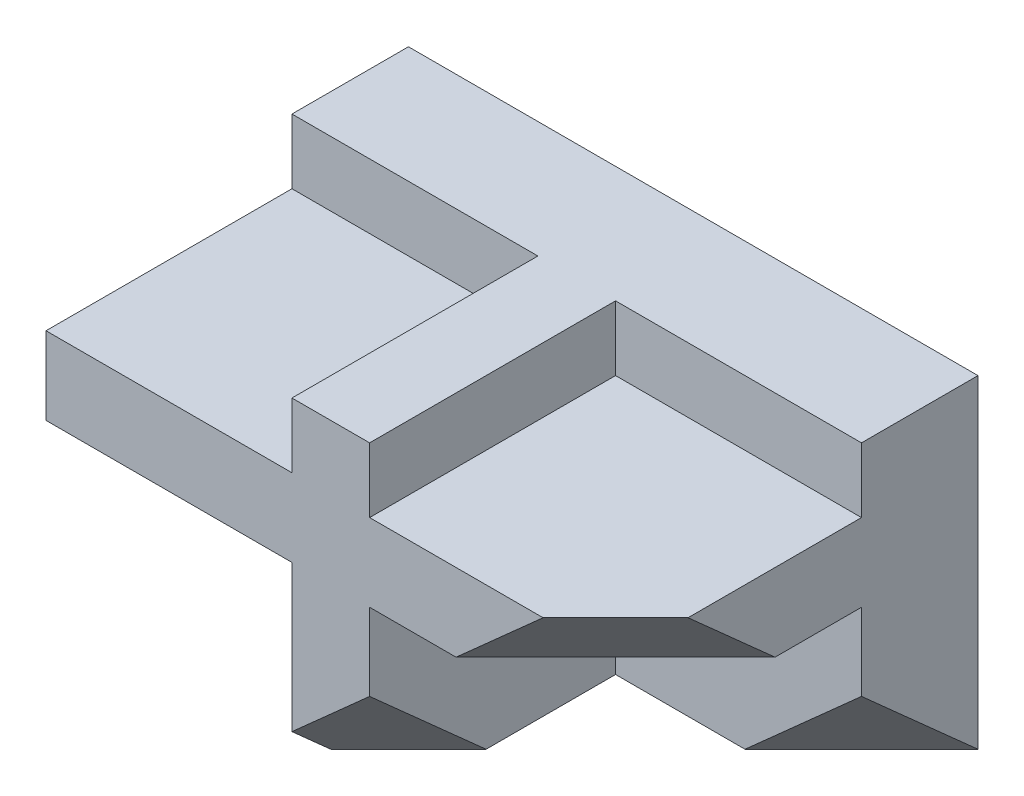
ISO-10303-21;
HEADER;
FILE_DESCRIPTION(('STEP AP214'),'2;1');
FILE_NAME('part.step','',(''),(''),'','','');
FILE_SCHEMA(('AUTOMOTIVE_DESIGN { 1 0 10303 214 1 1 1 1 }'));
ENDSEC;
DATA;
#1=APPLICATION_CONTEXT('core data for automotive mechanical design processes');
#2=APPLICATION_PROTOCOL_DEFINITION('international standard','automotive_design',2000,#1);
#3=PRODUCT_CONTEXT('',#1,'mechanical');
#4=PRODUCT('Part','Part','',(#3));
#5=PRODUCT_RELATED_PRODUCT_CATEGORY('part','',(#4));
#6=PRODUCT_DEFINITION_FORMATION('','',#4);
#7=PRODUCT_DEFINITION_CONTEXT('part definition',#1,'design');
#8=PRODUCT_DEFINITION('design','',#6,#7);
#9=PRODUCT_DEFINITION_SHAPE('','',#8);
#10=(LENGTH_UNIT() NAMED_UNIT(*) SI_UNIT(.MILLI.,.METRE.));
#11=(NAMED_UNIT(*) PLANE_ANGLE_UNIT() SI_UNIT($,.RADIAN.));
#12=(NAMED_UNIT(*) SI_UNIT($,.STERADIAN.) SOLID_ANGLE_UNIT());
#13=UNCERTAINTY_MEASURE_WITH_UNIT(LENGTH_MEASURE(1.E-05),#10,'distance_accuracy_value','');
#14=(GEOMETRIC_REPRESENTATION_CONTEXT(3) GLOBAL_UNCERTAINTY_ASSIGNED_CONTEXT((#13)) GLOBAL_UNIT_ASSIGNED_CONTEXT((#10,
#11,#12)) REPRESENTATION_CONTEXT('',''));
#15=CARTESIAN_POINT('',(0.,0.,0.));
#16=DIRECTION('',(0.,0.,1.));
#17=DIRECTION('',(1.,0.,0.));
#18=AXIS2_PLACEMENT_3D('',#15,#16,#17);
#19=CARTESIAN_POINT('',(0.,0.,18.));
#20=DIRECTION('',(0.,0.,1.));
#21=DIRECTION('',(1.,0.,0.));
#22=AXIS2_PLACEMENT_3D('',#19,#20,#21);
#23=PLANE('',#22);
#24=DIRECTION('',(1.,0.,0.));
#25=VECTOR('',#24,1.);
#26=CARTESIAN_POINT('',(44.,-25.,18.));
#27=LINE('',#26,#25);
#28=CARTESIAN_POINT('',(6.00000000000001,-25.,18.));
#29=VERTEX_POINT('',#28);
#30=CARTESIAN_POINT('',(25.9999999999998,-25.,18.));
#31=VERTEX_POINT('',#30);
#32=EDGE_CURVE('E219',#29,#31,#27,.T.);
#33=ORIENTED_EDGE('',*,*,#32,.T.);
#34=DIRECTION('',(0.745937661625918,0.666015769308849,0.));
#35=VECTOR('',#34,1.);
#36=CARTESIAN_POINT('',(23.9531582682752,-26.8275372604684,18.));
#37=LINE('',#36,#35);
#38=CARTESIAN_POINT('',(44.,-8.92857142857144,18.));
#39=VERTEX_POINT('',#38);
#40=EDGE_CURVE('E263',#31,#39,#37,.T.);
#41=ORIENTED_EDGE('',*,*,#40,.T.);
#42=DIRECTION('',(0.,1.,0.));
#43=VECTOR('',#42,1.);
#44=CARTESIAN_POINT('',(44.,-25.,18.));
#45=LINE('',#44,#43);
#46=CARTESIAN_POINT('',(44.,2.99999999999999,18.));
#47=VERTEX_POINT('',#46);
#48=EDGE_CURVE('E224',#39,#47,#45,.T.);
#49=ORIENTED_EDGE('',*,*,#48,.T.);
#50=DIRECTION('',(1.,0.,0.));
#51=VECTOR('',#50,1.);
#52=CARTESIAN_POINT('',(6.00000000000001,2.99999999999999,18.));
#53=LINE('',#52,#51);
#54=CARTESIAN_POINT('',(6.00000000000001,2.99999999999999,18.));
#55=VERTEX_POINT('',#54);
#56=EDGE_CURVE('E301',#55,#47,#53,.T.);
#57=ORIENTED_EDGE('',*,*,#56,.F.);
#58=DIRECTION('',(0.,1.,0.));
#59=VECTOR('',#58,1.);
#60=CARTESIAN_POINT('',(6.00000000000001,-25.,18.));
#61=LINE('',#60,#59);
#62=EDGE_CURVE('E298',#29,#55,#61,.T.);
#63=ORIENTED_EDGE('',*,*,#62,.F.);
#64=EDGE_LOOP('',(#33,#41,#49,#57,#63));
#65=FACE_BOUND('',#64,.T.);
#66=ADVANCED_FACE('F34',(#65),#23,.T.);
#67=CARTESIAN_POINT('',(44.,-25.,18.));
#68=DIRECTION('',(0.,1.,0.));
#69=DIRECTION('',(-1.,0.,0.));
#70=AXIS2_PLACEMENT_3D('',#67,#68,#69);
#71=PLANE('',#70);
#72=DIRECTION('',(-0.707106781186551,0.,0.707106781186544));
#73=VECTOR('',#72,1.);
#74=CARTESIAN_POINT('',(44.,-25.,0.));
#75=LINE('',#74,#73);
#76=CARTESIAN_POINT('',(6.,-25.,37.9999999999996));
#77=VERTEX_POINT('',#76);
#78=CARTESIAN_POINT('',(-6.,-25.,49.9999999999995));
#79=VERTEX_POINT('',#78);
#80=EDGE_CURVE('E167',#77,#79,#75,.T.);
#81=ORIENTED_EDGE('',*,*,#80,.T.);
#82=DIRECTION('',(0.,0.,-1.));
#83=VECTOR('',#82,1.);
#84=CARTESIAN_POINT('',(-5.99999999999999,-25.,56.));
#85=LINE('',#84,#83);
#86=CARTESIAN_POINT('',(-5.99999999999999,-25.,18.));
#87=VERTEX_POINT('',#86);
#88=EDGE_CURVE('E199',#79,#87,#85,.T.);
#89=ORIENTED_EDGE('',*,*,#88,.T.);
#90=CARTESIAN_POINT('',(-44.,-25.,18.));
#91=VERTEX_POINT('',#90);
#92=EDGE_CURVE('E221',#91,#87,#27,.T.);
#93=ORIENTED_EDGE('',*,*,#92,.F.);
#94=DIRECTION('',(0.,0.,-1.));
#95=VECTOR('',#94,1.);
#96=CARTESIAN_POINT('',(-44.,-25.,18.));
#97=LINE('',#96,#95);
#98=CARTESIAN_POINT('',(-44.,-25.,0.));
#99=VERTEX_POINT('',#98);
#100=EDGE_CURVE('E243',#91,#99,#97,.T.);
#101=ORIENTED_EDGE('',*,*,#100,.T.);
#102=DIRECTION('',(1.,0.,0.));
#103=VECTOR('',#102,1.);
#104=CARTESIAN_POINT('',(44.,-25.,0.));
#105=LINE('',#104,#103);
#106=CARTESIAN_POINT('',(44.,-25.,0.));
#107=VERTEX_POINT('',#106);
#108=EDGE_CURVE('E232',#99,#107,#105,.T.);
#109=ORIENTED_EDGE('',*,*,#108,.T.);
#110=EDGE_CURVE('E178',#107,#31,#75,.T.);
#111=ORIENTED_EDGE('',*,*,#110,.T.);
#112=ORIENTED_EDGE('',*,*,#32,.F.);
#113=DIRECTION('',(0.,0.,-1.));
#114=VECTOR('',#113,1.);
#115=CARTESIAN_POINT('',(6.00000000000001,-25.,56.));
#116=LINE('',#115,#114);
#117=EDGE_CURVE('E197',#77,#29,#116,.T.);
#118=ORIENTED_EDGE('',*,*,#117,.F.);
#119=EDGE_LOOP('',(#81,#89,#93,#101,#109,#111,#112,#118));
#120=FACE_BOUND('',#119,.T.);
#121=ADVANCED_FACE('F351',(#120),#71,.F.);
#122=CARTESIAN_POINT('',(44.,-25.,18.));
#123=DIRECTION('',(-1.,0.,0.));
#124=DIRECTION('',(0.,0.,1.));
#125=AXIS2_PLACEMENT_3D('',#122,#123,#124);
#126=PLANE('',#125);
#127=DIRECTION('',(0.,-0.666015769308852,-0.745937661625915));
#128=VECTOR('',#127,1.);
#129=CARTESIAN_POINT('',(44.,25.,56.));
#130=LINE('',#129,#128);
#131=EDGE_CURVE('E168',#39,#107,#130,.T.);
#132=ORIENTED_EDGE('',*,*,#131,.T.);
#133=DIRECTION('',(0.,1.,0.));
#134=VECTOR('',#133,1.);
#135=CARTESIAN_POINT('',(44.,-25.,0.));
#136=LINE('',#135,#134);
#137=CARTESIAN_POINT('',(44.,25.,0.));
#138=VERTEX_POINT('',#137);
#139=EDGE_CURVE('E235',#107,#138,#136,.T.);
#140=ORIENTED_EDGE('',*,*,#139,.T.);
#141=DIRECTION('',(0.,0.,-1.));
#142=VECTOR('',#141,1.);
#143=CARTESIAN_POINT('',(44.,25.,18.));
#144=LINE('',#143,#142);
#145=CARTESIAN_POINT('',(44.,25.,18.));
#146=VERTEX_POINT('',#145);
#147=EDGE_CURVE('E241',#146,#138,#144,.T.);
#148=ORIENTED_EDGE('',*,*,#147,.F.);
#149=CARTESIAN_POINT('',(44.,15.,18.));
#150=VERTEX_POINT('',#149);
#151=EDGE_CURVE('E184',#150,#146,#45,.T.);
#152=ORIENTED_EDGE('',*,*,#151,.F.);
#153=DIRECTION('',(0.,0.,-1.));
#154=VECTOR('',#153,1.);
#155=CARTESIAN_POINT('',(44.,15.,56.));
#156=LINE('',#155,#154);
#157=CARTESIAN_POINT('',(44.,15.,44.8));
#158=VERTEX_POINT('',#157);
#159=EDGE_CURVE('E174',#158,#150,#156,.T.);
#160=ORIENTED_EDGE('',*,*,#159,.F.);
#161=CARTESIAN_POINT('',(44.,2.99999999999999,31.36));
#162=VERTEX_POINT('',#161);
#163=EDGE_CURVE('E159',#158,#162,#130,.T.);
#164=ORIENTED_EDGE('',*,*,#163,.T.);
#165=DIRECTION('',(0.,0.,-1.));
#166=VECTOR('',#165,1.);
#167=CARTESIAN_POINT('',(44.,2.99999999999999,56.));
#168=LINE('',#167,#166);
#169=EDGE_CURVE('E185',#162,#47,#168,.T.);
#170=ORIENTED_EDGE('',*,*,#169,.T.);
#171=ORIENTED_EDGE('',*,*,#48,.F.);
#172=EDGE_LOOP('',(#132,#140,#148,#152,#160,#164,#170,#171));
#173=FACE_BOUND('',#172,.T.);
#174=ADVANCED_FACE('F182',(#173),#126,.F.);
#175=CARTESIAN_POINT('',(-5.99999999999999,2.99999999999999,56.));
#176=DIRECTION('',(1.,0.,0.));
#177=DIRECTION('',(0.,1.,0.));
#178=AXIS2_PLACEMENT_3D('',#175,#176,#177);
#179=PLANE('',#178);
#180=DIRECTION('',(0.,-0.666015769308853,-0.745937661625914));
#181=VECTOR('',#180,1.);
#182=CARTESIAN_POINT('',(-5.99999999999999,-9.59900638750862,67.2491128459898));
#183=LINE('',#182,#181);
#184=CARTESIAN_POINT('',(-5.99999999999999,-19.6428571428567,56.));
#185=VERTEX_POINT('',#184);
#186=EDGE_CURVE('E258',#185,#79,#183,.T.);
#187=ORIENTED_EDGE('',*,*,#186,.F.);
#188=DIRECTION('',(0.,-1.,0.));
#189=VECTOR('',#188,1.);
#190=CARTESIAN_POINT('',(-5.99999999999999,2.99999999999999,56.));
#191=LINE('',#190,#189);
#192=CARTESIAN_POINT('',(-5.99999999999999,2.99999999999999,56.));
#193=VERTEX_POINT('',#192);
#194=EDGE_CURVE('E279',#193,#185,#191,.T.);
#195=ORIENTED_EDGE('',*,*,#194,.F.);
#196=DIRECTION('',(0.,0.,-1.));
#197=VECTOR('',#196,1.);
#198=CARTESIAN_POINT('',(-5.99999999999999,2.99999999999999,56.));
#199=LINE('',#198,#197);
#200=CARTESIAN_POINT('',(-5.99999999999999,2.99999999999999,18.));
#201=VERTEX_POINT('',#200);
#202=EDGE_CURVE('E201',#193,#201,#199,.T.);
#203=ORIENTED_EDGE('',*,*,#202,.T.);
#204=DIRECTION('',(0.,-1.,0.));
#205=VECTOR('',#204,1.);
#206=CARTESIAN_POINT('',(-5.99999999999999,2.99999999999999,18.));
#207=LINE('',#206,#205);
#208=EDGE_CURVE('E295',#201,#87,#207,.T.);
#209=ORIENTED_EDGE('',*,*,#208,.T.);
#210=ORIENTED_EDGE('',*,*,#88,.F.);
#211=EDGE_LOOP('',(#187,#195,#203,#209,#210));
#212=FACE_BOUND('',#211,.T.);
#213=ADVANCED_FACE('F346',(#212),#179,.F.);
#214=CARTESIAN_POINT('',(6.00000000000001,-25.,56.));
#215=DIRECTION('',(-1.,0.,0.));
#216=DIRECTION('',(0.,0.,1.));
#217=AXIS2_PLACEMENT_3D('',#214,#215,#216);
#218=PLANE('',#217);
#219=DIRECTION('',(0.,0.666015769308853,0.745937661625914));
#220=VECTOR('',#219,1.);
#221=CARTESIAN_POINT('',(6.00000000000001,-16.0574875798437,48.0156139105747));
#222=LINE('',#221,#220);
#223=CARTESIAN_POINT('',(6.00000000000001,-8.92857142857108,56.));
#224=VERTEX_POINT('',#223);
#225=EDGE_CURVE('E57',#77,#224,#222,.T.);
#226=ORIENTED_EDGE('',*,*,#225,.F.);
#227=ORIENTED_EDGE('',*,*,#117,.T.);
#228=ORIENTED_EDGE('',*,*,#62,.T.);
#229=DIRECTION('',(0.,0.,-1.));
#230=VECTOR('',#229,1.);
#231=CARTESIAN_POINT('',(6.00000000000001,2.99999999999999,56.));
#232=LINE('',#231,#230);
#233=CARTESIAN_POINT('',(6.00000000000001,2.99999999999999,56.));
#234=VERTEX_POINT('',#233);
#235=EDGE_CURVE('E188',#234,#55,#232,.T.);
#236=ORIENTED_EDGE('',*,*,#235,.F.);
#237=DIRECTION('',(0.,1.,0.));
#238=VECTOR('',#237,1.);
#239=CARTESIAN_POINT('',(6.00000000000001,-25.,56.));
#240=LINE('',#239,#238);
#241=EDGE_CURVE('E281',#224,#234,#240,.T.);
#242=ORIENTED_EDGE('',*,*,#241,.F.);
#243=EDGE_LOOP('',(#226,#227,#228,#236,#242));
#244=FACE_BOUND('',#243,.T.);
#245=ADVANCED_FACE('F361',(#244),#218,.F.);
#246=CARTESIAN_POINT('',(6.00000000000001,2.99999999999999,56.));
#247=DIRECTION('',(0.,1.,0.));
#248=DIRECTION('',(0.,0.,1.));
#249=AXIS2_PLACEMENT_3D('',#246,#247,#248);
#250=PLANE('',#249);
#251=DIRECTION('',(0.707106781186551,0.,-0.707106781186544));
#252=VECTOR('',#251,1.);
#253=CARTESIAN_POINT('',(12.6799999999998,2.99999999999999,62.6799999999999));
#254=LINE('',#253,#252);
#255=CARTESIAN_POINT('',(19.3599999999997,2.99999999999999,56.));
#256=VERTEX_POINT('',#255);
#257=EDGE_CURVE('E162',#256,#162,#254,.T.);
#258=ORIENTED_EDGE('',*,*,#257,.F.);
#259=DIRECTION('',(1.,0.,0.));
#260=VECTOR('',#259,1.);
#261=CARTESIAN_POINT('',(6.00000000000001,2.99999999999999,56.));
#262=LINE('',#261,#260);
#263=EDGE_CURVE('E253',#234,#256,#262,.T.);
#264=ORIENTED_EDGE('',*,*,#263,.F.);
#265=ORIENTED_EDGE('',*,*,#235,.T.);
#266=ORIENTED_EDGE('',*,*,#56,.T.);
#267=ORIENTED_EDGE('',*,*,#169,.F.);
#268=EDGE_LOOP('',(#258,#264,#265,#266,#267));
#269=FACE_BOUND('',#268,.T.);
#270=ADVANCED_FACE('F255',(#269),#250,.F.);
#271=CARTESIAN_POINT('',(44.,15.,56.));
#272=DIRECTION('',(0.,-1.,0.));
#273=DIRECTION('',(1.,0.,0.));
#274=AXIS2_PLACEMENT_3D('',#271,#272,#273);
#275=PLANE('',#274);
#276=DIRECTION('',(-0.707106781186551,0.,0.707106781186544));
#277=VECTOR('',#276,1.);
#278=CARTESIAN_POINT('',(38.4,15.,50.3999999999999));
#279=LINE('',#278,#277);
#280=CARTESIAN_POINT('',(32.7999999999999,15.,56.));
#281=VERTEX_POINT('',#280);
#282=EDGE_CURVE('E49',#158,#281,#279,.T.);
#283=ORIENTED_EDGE('',*,*,#282,.F.);
#284=ORIENTED_EDGE('',*,*,#159,.T.);
#285=DIRECTION('',(-1.,0.,0.));
#286=VECTOR('',#285,1.);
#287=CARTESIAN_POINT('',(44.,15.,18.));
#288=LINE('',#287,#286);
#289=CARTESIAN_POINT('',(6.00000000000001,15.,18.));
#290=VERTEX_POINT('',#289);
#291=EDGE_CURVE('E303',#150,#290,#288,.T.);
#292=ORIENTED_EDGE('',*,*,#291,.T.);
#293=DIRECTION('',(0.,0.,-1.));
#294=VECTOR('',#293,1.);
#295=CARTESIAN_POINT('',(6.00000000000001,15.,56.));
#296=LINE('',#295,#294);
#297=CARTESIAN_POINT('',(6.00000000000001,15.,56.));
#298=VERTEX_POINT('',#297);
#299=EDGE_CURVE('E186',#298,#290,#296,.T.);
#300=ORIENTED_EDGE('',*,*,#299,.F.);
#301=DIRECTION('',(-1.,0.,0.));
#302=VECTOR('',#301,1.);
#303=CARTESIAN_POINT('',(44.,15.,56.));
#304=LINE('',#303,#302);
#305=EDGE_CURVE('E177',#281,#298,#304,.T.);
#306=ORIENTED_EDGE('',*,*,#305,.F.);
#307=EDGE_LOOP('',(#283,#284,#292,#300,#306));
#308=FACE_BOUND('',#307,.T.);
#309=ADVANCED_FACE('F172',(#308),#275,.F.);
#310=CARTESIAN_POINT('',(0.,0.,56.));
#311=DIRECTION('',(0.,0.,1.));
#312=DIRECTION('',(1.,0.,0.));
#313=AXIS2_PLACEMENT_3D('',#310,#311,#312);
#314=PLANE('',#313);
#315=ORIENTED_EDGE('',*,*,#194,.T.);
#316=DIRECTION('',(0.745937661625918,0.666015769308849,0.));
#317=VECTOR('',#316,1.);
#318=CARTESIAN_POINT('',(7.09723207948879,-7.94889992902753,56.));
#319=LINE('',#318,#317);
#320=EDGE_CURVE('E11',#185,#224,#319,.T.);
#321=ORIENTED_EDGE('',*,*,#320,.T.);
#322=ORIENTED_EDGE('',*,*,#241,.T.);
#323=ORIENTED_EDGE('',*,*,#263,.T.);
#324=EDGE_CURVE('E38',#256,#281,#319,.T.);
#325=ORIENTED_EDGE('',*,*,#324,.T.);
#326=ORIENTED_EDGE('',*,*,#305,.T.);
#327=DIRECTION('',(0.,1.,0.));
#328=VECTOR('',#327,1.);
#329=CARTESIAN_POINT('',(6.00000000000001,15.,56.));
#330=LINE('',#329,#328);
#331=CARTESIAN_POINT('',(6.00000000000001,25.,56.));
#332=VERTEX_POINT('',#331);
#333=EDGE_CURVE('E285',#298,#332,#330,.T.);
#334=ORIENTED_EDGE('',*,*,#333,.T.);
#335=DIRECTION('',(-1.,0.,0.));
#336=VECTOR('',#335,1.);
#337=CARTESIAN_POINT('',(6.00000000000001,25.,56.));
#338=LINE('',#337,#336);
#339=CARTESIAN_POINT('',(-5.99999999999999,25.,56.));
#340=VERTEX_POINT('',#339);
#341=EDGE_CURVE('E267',#332,#340,#338,.T.);
#342=ORIENTED_EDGE('',*,*,#341,.T.);
#343=DIRECTION('',(0.,-1.,0.));
#344=VECTOR('',#343,1.);
#345=CARTESIAN_POINT('',(-5.99999999999999,25.,56.));
#346=LINE('',#345,#344);
#347=CARTESIAN_POINT('',(-5.99999999999999,15.,56.));
#348=VERTEX_POINT('',#347);
#349=EDGE_CURVE('E270',#340,#348,#346,.T.);
#350=ORIENTED_EDGE('',*,*,#349,.T.);
#351=DIRECTION('',(-1.,0.,0.));
#352=VECTOR('',#351,1.);
#353=CARTESIAN_POINT('',(-5.99999999999999,15.,56.));
#354=LINE('',#353,#352);
#355=CARTESIAN_POINT('',(-44.,15.,56.));
#356=VERTEX_POINT('',#355);
#357=EDGE_CURVE('E273',#348,#356,#354,.T.);
#358=ORIENTED_EDGE('',*,*,#357,.T.);
#359=DIRECTION('',(0.,-1.,0.));
#360=VECTOR('',#359,1.);
#361=CARTESIAN_POINT('',(-44.,15.,56.));
#362=LINE('',#361,#360);
#363=CARTESIAN_POINT('',(-44.,2.99999999999999,56.));
#364=VERTEX_POINT('',#363);
#365=EDGE_CURVE('E275',#356,#364,#362,.T.);
#366=ORIENTED_EDGE('',*,*,#365,.T.);
#367=DIRECTION('',(1.,0.,0.));
#368=VECTOR('',#367,1.);
#369=CARTESIAN_POINT('',(-44.,2.99999999999999,56.));
#370=LINE('',#369,#368);
#371=EDGE_CURVE('E277',#364,#193,#370,.T.);
#372=ORIENTED_EDGE('',*,*,#371,.T.);
#373=EDGE_LOOP('',(#315,#321,#322,#323,#325,#326,#334,#342,#350,#358,#366,#372));
#374=FACE_BOUND('',#373,.T.);
#375=ADVANCED_FACE('F251',(#374),#314,.T.);
#376=DIRECTION('',(0.,1.,0.));
#377=VECTOR('',#376,1.);
#378=CARTESIAN_POINT('',(6.00000000000001,15.,18.));
#379=LINE('',#378,#377);
#380=CARTESIAN_POINT('',(6.00000000000001,25.,18.));
#381=VERTEX_POINT('',#380);
#382=EDGE_CURVE('E271',#290,#381,#379,.T.);
#383=ORIENTED_EDGE('',*,*,#382,.F.);
#384=ORIENTED_EDGE('',*,*,#291,.F.);
#385=ORIENTED_EDGE('',*,*,#151,.T.);
#386=DIRECTION('',(-1.,0.,0.));
#387=VECTOR('',#386,1.);
#388=CARTESIAN_POINT('',(44.,25.,18.));
#389=LINE('',#388,#387);
#390=EDGE_CURVE('E227',#146,#381,#389,.T.);
#391=ORIENTED_EDGE('',*,*,#390,.T.);
#392=EDGE_LOOP('',(#383,#384,#385,#391));
#393=FACE_BOUND('',#392,.T.);
#394=ADVANCED_FACE('F317',(#393),#23,.T.);
#395=ORIENTED_EDGE('',*,*,#208,.F.);
#396=DIRECTION('',(1.,0.,0.));
#397=VECTOR('',#396,1.);
#398=CARTESIAN_POINT('',(-44.,2.99999999999999,18.));
#399=LINE('',#398,#397);
#400=CARTESIAN_POINT('',(-44.,2.99999999999999,18.));
#401=VERTEX_POINT('',#400);
#402=EDGE_CURVE('E292',#401,#201,#399,.T.);
#403=ORIENTED_EDGE('',*,*,#402,.F.);
#404=DIRECTION('',(0.,-1.,0.));
#405=VECTOR('',#404,1.);
#406=CARTESIAN_POINT('',(-44.,-25.,18.));
#407=LINE('',#406,#405);
#408=EDGE_CURVE('E220',#401,#91,#407,.T.);
#409=ORIENTED_EDGE('',*,*,#408,.T.);
#410=ORIENTED_EDGE('',*,*,#92,.T.);
#411=EDGE_LOOP('',(#395,#403,#409,#410));
#412=FACE_BOUND('',#411,.T.);
#413=ADVANCED_FACE('F380',(#412),#23,.T.);
#414=CARTESIAN_POINT('',(-44.,-25.,18.));
#415=DIRECTION('',(1.,0.,0.));
#416=DIRECTION('',(0.,0.,-1.));
#417=AXIS2_PLACEMENT_3D('',#414,#415,#416);
#418=PLANE('',#417);
#419=DIRECTION('',(0.,-1.,0.));
#420=VECTOR('',#419,1.);
#421=CARTESIAN_POINT('',(-44.,-25.,0.));
#422=LINE('',#421,#420);
#423=CARTESIAN_POINT('',(-44.,25.,0.));
#424=VERTEX_POINT('',#423);
#425=EDGE_CURVE('E216',#424,#99,#422,.T.);
#426=ORIENTED_EDGE('',*,*,#425,.T.);
#427=ORIENTED_EDGE('',*,*,#100,.F.);
#428=ORIENTED_EDGE('',*,*,#408,.F.);
#429=DIRECTION('',(0.,0.,-1.));
#430=VECTOR('',#429,1.);
#431=CARTESIAN_POINT('',(-44.,2.99999999999999,56.));
#432=LINE('',#431,#430);
#433=EDGE_CURVE('E204',#364,#401,#432,.T.);
#434=ORIENTED_EDGE('',*,*,#433,.F.);
#435=ORIENTED_EDGE('',*,*,#365,.F.);
#436=DIRECTION('',(0.,0.,-1.));
#437=VECTOR('',#436,1.);
#438=CARTESIAN_POINT('',(-44.,15.,56.));
#439=LINE('',#438,#437);
#440=CARTESIAN_POINT('',(-44.,15.,18.));
#441=VERTEX_POINT('',#440);
#442=EDGE_CURVE('E207',#356,#441,#439,.T.);
#443=ORIENTED_EDGE('',*,*,#442,.T.);
#444=CARTESIAN_POINT('',(-44.,25.,18.));
#445=VERTEX_POINT('',#444);
#446=EDGE_CURVE('E217',#445,#441,#407,.T.);
#447=ORIENTED_EDGE('',*,*,#446,.F.);
#448=DIRECTION('',(0.,0.,-1.));
#449=VECTOR('',#448,1.);
#450=CARTESIAN_POINT('',(-44.,25.,18.));
#451=LINE('',#450,#449);
#452=EDGE_CURVE('E229',#445,#424,#451,.T.);
#453=ORIENTED_EDGE('',*,*,#452,.T.);
#454=EDGE_LOOP('',(#426,#427,#428,#434,#435,#443,#447,#453));
#455=FACE_BOUND('',#454,.T.);
#456=ADVANCED_FACE('F36',(#455),#418,.F.);
#457=CARTESIAN_POINT('',(44.,25.,18.));
#458=DIRECTION('',(0.,-1.,0.));
#459=DIRECTION('',(1.,0.,0.));
#460=AXIS2_PLACEMENT_3D('',#457,#458,#459);
#461=PLANE('',#460);
#462=DIRECTION('',(-1.,0.,0.));
#463=VECTOR('',#462,1.);
#464=CARTESIAN_POINT('',(44.,25.,0.));
#465=LINE('',#464,#463);
#466=EDGE_CURVE('E237',#138,#424,#465,.T.);
#467=ORIENTED_EDGE('',*,*,#466,.T.);
#468=ORIENTED_EDGE('',*,*,#452,.F.);
#469=CARTESIAN_POINT('',(-5.99999999999999,25.,18.));
#470=VERTEX_POINT('',#469);
#471=EDGE_CURVE('E226',#470,#445,#389,.T.);
#472=ORIENTED_EDGE('',*,*,#471,.F.);
#473=DIRECTION('',(0.,0.,-1.));
#474=VECTOR('',#473,1.);
#475=CARTESIAN_POINT('',(-5.99999999999999,25.,56.));
#476=LINE('',#475,#474);
#477=EDGE_CURVE('E213',#340,#470,#476,.T.);
#478=ORIENTED_EDGE('',*,*,#477,.F.);
#479=ORIENTED_EDGE('',*,*,#341,.F.);
#480=DIRECTION('',(0.,0.,-1.));
#481=VECTOR('',#480,1.);
#482=CARTESIAN_POINT('',(6.00000000000001,25.,56.));
#483=LINE('',#482,#481);
#484=EDGE_CURVE('E191',#332,#381,#483,.T.);
#485=ORIENTED_EDGE('',*,*,#484,.T.);
#486=ORIENTED_EDGE('',*,*,#390,.F.);
#487=ORIENTED_EDGE('',*,*,#147,.T.);
#488=EDGE_LOOP('',(#467,#468,#472,#478,#479,#485,#486,#487));
#489=FACE_BOUND('',#488,.T.);
#490=ADVANCED_FACE('F311',(#489),#461,.F.);
#491=DIRECTION('',(-1.,0.,0.));
#492=VECTOR('',#491,1.);
#493=CARTESIAN_POINT('',(-5.99999999999999,15.,18.));
#494=LINE('',#493,#492);
#495=CARTESIAN_POINT('',(-5.99999999999999,15.,18.));
#496=VERTEX_POINT('',#495);
#497=EDGE_CURVE('E289',#496,#441,#494,.T.);
#498=ORIENTED_EDGE('',*,*,#497,.F.);
#499=DIRECTION('',(0.,-1.,0.));
#500=VECTOR('',#499,1.);
#501=CARTESIAN_POINT('',(-5.99999999999999,25.,18.));
#502=LINE('',#501,#500);
#503=EDGE_CURVE('E266',#470,#496,#502,.T.);
#504=ORIENTED_EDGE('',*,*,#503,.F.);
#505=ORIENTED_EDGE('',*,*,#471,.T.);
#506=ORIENTED_EDGE('',*,*,#446,.T.);
#507=EDGE_LOOP('',(#498,#504,#505,#506));
#508=FACE_BOUND('',#507,.T.);
#509=ADVANCED_FACE('F372',(#508),#23,.T.);
#510=CARTESIAN_POINT('',(0.,0.,0.));
#511=DIRECTION('',(0.,0.,1.));
#512=DIRECTION('',(1.,0.,0.));
#513=AXIS2_PLACEMENT_3D('',#510,#511,#512);
#514=PLANE('',#513);
#515=ORIENTED_EDGE('',*,*,#425,.F.);
#516=ORIENTED_EDGE('',*,*,#466,.F.);
#517=ORIENTED_EDGE('',*,*,#139,.F.);
#518=ORIENTED_EDGE('',*,*,#108,.F.);
#519=EDGE_LOOP('',(#515,#516,#517,#518));
#520=FACE_BOUND('',#519,.T.);
#521=ADVANCED_FACE('F323',(#520),#514,.F.);
#522=CARTESIAN_POINT('',(-5.99999999999999,25.,56.));
#523=DIRECTION('',(1.,0.,0.));
#524=DIRECTION('',(0.,1.,0.));
#525=AXIS2_PLACEMENT_3D('',#522,#523,#524);
#526=PLANE('',#525);
#527=ORIENTED_EDGE('',*,*,#503,.T.);
#528=DIRECTION('',(0.,0.,-1.));
#529=VECTOR('',#528,1.);
#530=CARTESIAN_POINT('',(-5.99999999999999,15.,56.));
#531=LINE('',#530,#529);
#532=EDGE_CURVE('E210',#348,#496,#531,.T.);
#533=ORIENTED_EDGE('',*,*,#532,.F.);
#534=ORIENTED_EDGE('',*,*,#349,.F.);
#535=ORIENTED_EDGE('',*,*,#477,.T.);
#536=EDGE_LOOP('',(#527,#533,#534,#535));
#537=FACE_BOUND('',#536,.T.);
#538=ADVANCED_FACE('F330',(#537),#526,.F.);
#539=CARTESIAN_POINT('',(-5.99999999999999,15.,56.));
#540=DIRECTION('',(0.,-1.,0.));
#541=DIRECTION('',(1.,0.,0.));
#542=AXIS2_PLACEMENT_3D('',#539,#540,#541);
#543=PLANE('',#542);
#544=ORIENTED_EDGE('',*,*,#497,.T.);
#545=ORIENTED_EDGE('',*,*,#442,.F.);
#546=ORIENTED_EDGE('',*,*,#357,.F.);
#547=ORIENTED_EDGE('',*,*,#532,.T.);
#548=EDGE_LOOP('',(#544,#545,#546,#547));
#549=FACE_BOUND('',#548,.T.);
#550=ADVANCED_FACE('F337',(#549),#543,.F.);
#551=CARTESIAN_POINT('',(-44.,2.99999999999999,56.));
#552=DIRECTION('',(0.,1.,0.));
#553=DIRECTION('',(0.,0.,1.));
#554=AXIS2_PLACEMENT_3D('',#551,#552,#553);
#555=PLANE('',#554);
#556=ORIENTED_EDGE('',*,*,#402,.T.);
#557=ORIENTED_EDGE('',*,*,#202,.F.);
#558=ORIENTED_EDGE('',*,*,#371,.F.);
#559=ORIENTED_EDGE('',*,*,#433,.T.);
#560=EDGE_LOOP('',(#556,#557,#558,#559));
#561=FACE_BOUND('',#560,.T.);
#562=ADVANCED_FACE('F341',(#561),#555,.F.);
#563=CARTESIAN_POINT('',(6.00000000000001,15.,56.));
#564=DIRECTION('',(-1.,0.,0.));
#565=DIRECTION('',(0.,0.,1.));
#566=AXIS2_PLACEMENT_3D('',#563,#564,#565);
#567=PLANE('',#566);
#568=ORIENTED_EDGE('',*,*,#382,.T.);
#569=ORIENTED_EDGE('',*,*,#484,.F.);
#570=ORIENTED_EDGE('',*,*,#333,.F.);
#571=ORIENTED_EDGE('',*,*,#299,.T.);
#572=EDGE_LOOP('',(#568,#569,#570,#571));
#573=FACE_BOUND('',#572,.T.);
#574=ADVANCED_FACE('F315',(#573),#567,.F.);
#575=CARTESIAN_POINT('',(22.1238938053095,-24.7787610619469,22.1238938053097));
#576=DIRECTION('',(0.554325087698112,-0.620844098221892,0.554325087698118));
#577=DIRECTION('',(0.,-0.666015769308853,-0.745937661625914));
#578=AXIS2_PLACEMENT_3D('',#575,#576,#577);
#579=PLANE('',#578);
#580=ORIENTED_EDGE('',*,*,#257,.T.);
#581=ORIENTED_EDGE('',*,*,#163,.F.);
#582=ORIENTED_EDGE('',*,*,#282,.T.);
#583=ORIENTED_EDGE('',*,*,#324,.F.);
#584=EDGE_LOOP('',(#580,#581,#582,#583));
#585=FACE_BOUND('',#584,.T.);
#586=ADVANCED_FACE('F160',(#585),#579,.T.);
#587=ORIENTED_EDGE('',*,*,#186,.T.);
#588=ORIENTED_EDGE('',*,*,#80,.F.);
#589=ORIENTED_EDGE('',*,*,#225,.T.);
#590=ORIENTED_EDGE('',*,*,#320,.F.);
#591=EDGE_LOOP('',(#587,#588,#589,#590));
#592=FACE_BOUND('',#591,.T.);
#593=ADVANCED_FACE('F349',(#592),#579,.T.);
#594=ORIENTED_EDGE('',*,*,#110,.F.);
#595=ORIENTED_EDGE('',*,*,#131,.F.);
#596=ORIENTED_EDGE('',*,*,#40,.F.);
#597=EDGE_LOOP('',(#594,#595,#596));
#598=FACE_BOUND('',#597,.T.);
#599=ADVANCED_FACE('F494',(#598),#579,.T.);
#600=CLOSED_SHELL('',(#66,#121,#174,#213,#245,#270,#309,#375,#394,#413,#456,#490,#509,#521,#538,
#550,#562,#574,#586,#593,#599));
#601=MANIFOLD_SOLID_BREP('B2',#600);
#602=ADVANCED_BREP_SHAPE_REPRESENTATION('',(#18,#601),#14);
#603=SHAPE_DEFINITION_REPRESENTATION(#9,#602);
ENDSEC;
END-ISO-10303-21;
